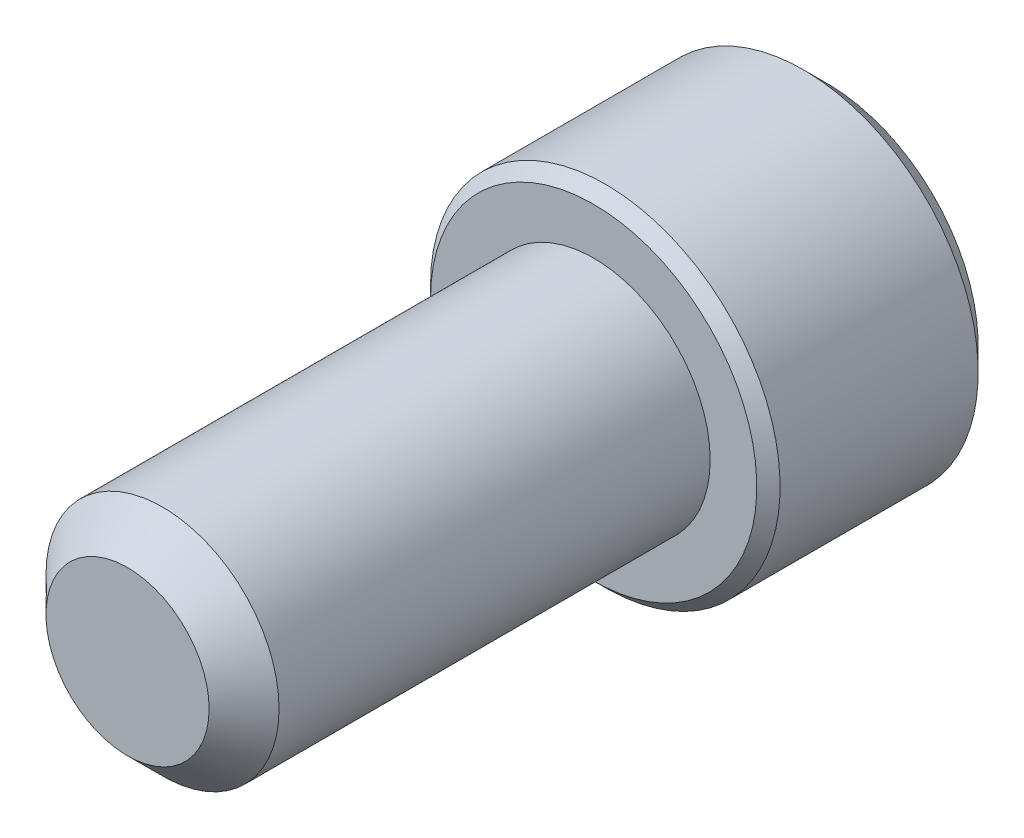
ISO-10303-21;
HEADER;
FILE_DESCRIPTION(('STEP AP214'),'2;1');
FILE_NAME('part.step','',(''),(''),'','','');
FILE_SCHEMA(('AUTOMOTIVE_DESIGN { 1 0 10303 214 1 1 1 1 }'));
ENDSEC;
DATA;
#1=APPLICATION_CONTEXT('core data for automotive mechanical design processes');
#2=APPLICATION_PROTOCOL_DEFINITION('international standard','automotive_design',2000,#1);
#3=PRODUCT_CONTEXT('',#1,'mechanical');
#4=PRODUCT('Part','Part','',(#3));
#5=PRODUCT_RELATED_PRODUCT_CATEGORY('part','',(#4));
#6=PRODUCT_DEFINITION_FORMATION('','',#4);
#7=PRODUCT_DEFINITION_CONTEXT('part definition',#1,'design');
#8=PRODUCT_DEFINITION('design','',#6,#7);
#9=PRODUCT_DEFINITION_SHAPE('','',#8);
#10=(LENGTH_UNIT() NAMED_UNIT(*) SI_UNIT(.MILLI.,.METRE.));
#11=(NAMED_UNIT(*) PLANE_ANGLE_UNIT() SI_UNIT($,.RADIAN.));
#12=(NAMED_UNIT(*) SI_UNIT($,.STERADIAN.) SOLID_ANGLE_UNIT());
#13=UNCERTAINTY_MEASURE_WITH_UNIT(LENGTH_MEASURE(1.E-05),#10,'distance_accuracy_value','');
#14=(GEOMETRIC_REPRESENTATION_CONTEXT(3) GLOBAL_UNCERTAINTY_ASSIGNED_CONTEXT((#13)) GLOBAL_UNIT_ASSIGNED_CONTEXT((#10,
#11,#12)) REPRESENTATION_CONTEXT('',''));
#15=CARTESIAN_POINT('',(0.,0.,0.));
#16=DIRECTION('',(0.,0.,1.));
#17=DIRECTION('',(1.,0.,0.));
#18=AXIS2_PLACEMENT_3D('',#15,#16,#17);
#19=CARTESIAN_POINT('',(0.,0.,-12.7));
#20=DIRECTION('',(0.,0.,1.));
#21=DIRECTION('',(1.,0.,0.));
#22=AXIS2_PLACEMENT_3D('',#19,#20,#21);
#23=CYLINDRICAL_SURFACE('',#22,3.175);
#24=CARTESIAN_POINT('',(0.,0.,-0.952500000000004));
#25=DIRECTION('',(0.,0.,1.));
#26=DIRECTION('',(1.,0.,0.));
#27=AXIS2_PLACEMENT_3D('',#24,#25,#26);
#28=CIRCLE('',#27,3.175);
#29=CARTESIAN_POINT('',(3.175,0.,-0.952500000000004));
#30=VERTEX_POINT('',#29);
#31=EDGE_CURVE('E113',#30,#30,#28,.F.);
#32=ORIENTED_EDGE('',*,*,#31,.T.);
#33=EDGE_LOOP('',(#32));
#34=FACE_BOUND('',#33,.T.);
#35=CARTESIAN_POINT('',(0.,0.,-12.7));
#36=DIRECTION('',(0.,0.,-1.));
#37=DIRECTION('',(-1.,0.,0.));
#38=AXIS2_PLACEMENT_3D('',#35,#36,#37);
#39=CIRCLE('',#38,3.175);
#40=CARTESIAN_POINT('',(-3.175,0.,-12.7));
#41=VERTEX_POINT('',#40);
#42=EDGE_CURVE('E218',#41,#41,#39,.F.);
#43=ORIENTED_EDGE('',*,*,#42,.T.);
#44=EDGE_LOOP('',(#43));
#45=FACE_BOUND('',#44,.T.);
#46=ADVANCED_FACE('F39',(#34,#45),#23,.T.);
#47=CARTESIAN_POINT('',(0.,0.,0.));
#48=DIRECTION('',(0.,0.,1.));
#49=DIRECTION('',(1.,0.,0.));
#50=AXIS2_PLACEMENT_3D('',#47,#48,#49);
#51=PLANE('',#50);
#52=CARTESIAN_POINT('',(0.,0.,0.));
#53=DIRECTION('',(0.,0.,1.));
#54=DIRECTION('',(1.,0.,0.));
#55=AXIS2_PLACEMENT_3D('',#52,#53,#54);
#56=CIRCLE('',#55,2.2225);
#57=CARTESIAN_POINT('',(2.2225,0.,0.));
#58=VERTEX_POINT('',#57);
#59=EDGE_CURVE('E217',#58,#58,#56,.T.);
#60=ORIENTED_EDGE('',*,*,#59,.T.);
#61=EDGE_LOOP('',(#60));
#62=FACE_BOUND('',#61,.T.);
#63=ADVANCED_FACE('F194',(#62),#51,.T.);
#64=CARTESIAN_POINT('',(0.,0.,0.));
#65=DIRECTION('',(0.,0.,-1.));
#66=DIRECTION('',(-1.,0.,0.));
#67=AXIS2_PLACEMENT_3D('',#64,#65,#66);
#68=CONICAL_SURFACE('',#67,2.2225,0.785398163397447);
#69=ORIENTED_EDGE('',*,*,#31,.F.);
#70=EDGE_LOOP('',(#69));
#71=FACE_BOUND('',#70,.T.);
#72=ORIENTED_EDGE('',*,*,#59,.F.);
#73=EDGE_LOOP('',(#72));
#74=FACE_BOUND('',#73,.T.);
#75=ADVANCED_FACE('F200',(#71,#74),#68,.T.);
#76=CARTESIAN_POINT('',(0.,0.,-19.05));
#77=DIRECTION('',(0.,0.,1.));
#78=DIRECTION('',(1.,0.,0.));
#79=AXIS2_PLACEMENT_3D('',#76,#77,#78);
#80=CYLINDRICAL_SURFACE('',#79,4.7625);
#81=CARTESIAN_POINT('',(0.,0.,-13.0175));
#82=DIRECTION('',(0.,0.,-1.));
#83=DIRECTION('',(-1.,0.,0.));
#84=AXIS2_PLACEMENT_3D('',#81,#82,#83);
#85=CIRCLE('',#84,4.7625);
#86=CARTESIAN_POINT('',(-4.7625,0.,-13.0175));
#87=VERTEX_POINT('',#86);
#88=EDGE_CURVE('E47',#87,#87,#85,.T.);
#89=ORIENTED_EDGE('',*,*,#88,.T.);
#90=EDGE_LOOP('',(#89));
#91=FACE_BOUND('',#90,.T.);
#92=CARTESIAN_POINT('',(0.,0.,-18.415));
#93=DIRECTION('',(0.,0.,-1.));
#94=DIRECTION('',(-1.,0.,0.));
#95=AXIS2_PLACEMENT_3D('',#92,#93,#94);
#96=CIRCLE('',#95,4.7625);
#97=CARTESIAN_POINT('',(-4.7625,0.,-18.415));
#98=VERTEX_POINT('',#97);
#99=EDGE_CURVE('E176',#98,#98,#96,.F.);
#100=ORIENTED_EDGE('',*,*,#99,.T.);
#101=EDGE_LOOP('',(#100));
#102=FACE_BOUND('',#101,.T.);
#103=ADVANCED_FACE('F181',(#91,#102),#80,.T.);
#104=CARTESIAN_POINT('',(0.,0.,-19.05));
#105=DIRECTION('',(0.,0.,-1.));
#106=DIRECTION('',(-1.,0.,0.));
#107=AXIS2_PLACEMENT_3D('',#104,#105,#106);
#108=PLANE('',#107);
#109=CARTESIAN_POINT('',(0.,0.,-19.05));
#110=DIRECTION('',(0.,0.,-1.));
#111=DIRECTION('',(-1.,0.,0.));
#112=AXIS2_PLACEMENT_3D('',#109,#110,#111);
#113=CIRCLE('',#112,4.1275);
#114=CARTESIAN_POINT('',(-4.1275,0.,-19.05));
#115=VERTEX_POINT('',#114);
#116=EDGE_CURVE('E112',#115,#115,#113,.T.);
#117=ORIENTED_EDGE('',*,*,#116,.T.);
#118=EDGE_LOOP('',(#117));
#119=FACE_BOUND('',#118,.T.);
#120=CARTESIAN_POINT('',(0.,0.,-19.05));
#121=DIRECTION('',(0.,0.,-1.));
#122=DIRECTION('',(-1.,0.,0.));
#123=AXIS2_PLACEMENT_3D('',#120,#121,#122);
#124=CIRCLE('',#123,2.74963065701559);
#125=CARTESIAN_POINT('',(-2.38125,1.3748153285078,-19.05));
#126=VERTEX_POINT('',#125);
#127=CARTESIAN_POINT('',(0.,2.74963065701559,-19.05));
#128=VERTEX_POINT('',#127);
#129=EDGE_CURVE('E93',#126,#128,#124,.T.);
#130=ORIENTED_EDGE('',*,*,#129,.F.);
#131=CARTESIAN_POINT('',(-2.38125,-1.3748153285078,-19.05));
#132=VERTEX_POINT('',#131);
#133=EDGE_CURVE('E53',#132,#126,#124,.T.);
#134=ORIENTED_EDGE('',*,*,#133,.F.);
#135=CARTESIAN_POINT('',(0.,-2.74963065701559,-19.05));
#136=VERTEX_POINT('',#135);
#137=EDGE_CURVE('E277',#136,#132,#124,.T.);
#138=ORIENTED_EDGE('',*,*,#137,.F.);
#139=CARTESIAN_POINT('',(2.38125,-1.3748153285078,-19.05));
#140=VERTEX_POINT('',#139);
#141=EDGE_CURVE('E60',#140,#136,#124,.T.);
#142=ORIENTED_EDGE('',*,*,#141,.F.);
#143=CARTESIAN_POINT('',(2.38125,1.3748153285078,-19.05));
#144=VERTEX_POINT('',#143);
#145=EDGE_CURVE('E134',#144,#140,#124,.T.);
#146=ORIENTED_EDGE('',*,*,#145,.F.);
#147=EDGE_CURVE('E102',#128,#144,#124,.T.);
#148=ORIENTED_EDGE('',*,*,#147,.F.);
#149=EDGE_LOOP('',(#130,#134,#138,#142,#146,#148));
#150=FACE_BOUND('',#149,.T.);
#151=ADVANCED_FACE('F133',(#119,#150),#108,.T.);
#152=CARTESIAN_POINT('',(0.,0.,-12.7));
#153=DIRECTION('',(0.,0.,-1.));
#154=DIRECTION('',(-1.,0.,0.));
#155=AXIS2_PLACEMENT_3D('',#152,#153,#154);
#156=PLANE('',#155);
#157=CARTESIAN_POINT('',(0.,0.,-12.7));
#158=DIRECTION('',(0.,0.,-1.));
#159=DIRECTION('',(-1.,0.,0.));
#160=AXIS2_PLACEMENT_3D('',#157,#158,#159);
#161=CIRCLE('',#160,4.44499999999999);
#162=CARTESIAN_POINT('',(-4.44499999999999,0.,-12.7));
#163=VERTEX_POINT('',#162);
#164=EDGE_CURVE('E11',#163,#163,#161,.F.);
#165=ORIENTED_EDGE('',*,*,#164,.T.);
#166=EDGE_LOOP('',(#165));
#167=FACE_BOUND('',#166,.T.);
#168=ORIENTED_EDGE('',*,*,#42,.F.);
#169=EDGE_LOOP('',(#168));
#170=FACE_BOUND('',#169,.T.);
#171=ADVANCED_FACE('F289',(#167,#170),#156,.F.);
#172=CARTESIAN_POINT('',(0.,0.,-19.05));
#173=DIRECTION('',(0.,0.,-1.));
#174=DIRECTION('',(-1.,0.,0.));
#175=AXIS2_PLACEMENT_3D('',#172,#173,#174);
#176=CONICAL_SURFACE('',#175,2.74963065701559,0.78539816339745);
#177=ORIENTED_EDGE('',*,*,#147,.T.);
#178=CARTESIAN_POINT('',(-0.000199999999999846,2.74974612706943,-19.0501154773272));
#179=CARTESIAN_POINT('',(0.0816567823790501,2.70248609172789,-19.0028948967095));
#180=CARTESIAN_POINT('',(0.16488233377176,2.65443579722785,-18.9584475752929));
#181=CARTESIAN_POINT('',(0.334588480838039,2.556455907536,-18.8770654569856));
#182=CARTESIAN_POINT('',(0.421085217353101,2.50651699342501,-18.8401759430951));
#183=CARTESIAN_POINT('',(0.59550177400904,2.40581754748857,-18.7769834131659));
#184=CARTESIAN_POINT('',(0.683377171180672,2.35508266327639,-18.7505215587295));
#185=CARTESIAN_POINT('',(0.861062594070872,2.25249593653966,-18.7097515156161));
#186=CARTESIAN_POINT('',(0.950867191185867,2.20064722822085,-18.6954128915305));
#187=CARTESIAN_POINT('',(1.10563960313034,2.11128933452158,-18.6824757847701));
#188=CARTESIAN_POINT('',(1.17040744896961,2.07389560129144,-18.6805606046532));
#189=CARTESIAN_POINT('',(1.29983727933557,1.99916925388849,-18.6837866227677));
#190=CARTESIAN_POINT('',(1.36449921879335,1.96183666573622,-18.6889302948571));
#191=CARTESIAN_POINT('',(1.49321254857739,1.88752399013711,-18.7059813108716));
#192=CARTESIAN_POINT('',(1.55726317423485,1.85054434417201,-18.7178962213493));
#193=CARTESIAN_POINT('',(1.68425683890527,1.77722451768917,-18.747835672352));
#194=CARTESIAN_POINT('',(1.74719996243582,1.74088428837517,-18.7658597445184));
#195=CARTESIAN_POINT('',(1.90842615073218,1.64780030516185,-18.8193688075524));
#196=CARTESIAN_POINT('',(2.00570949128784,1.59163374230437,-18.8588874208722));
#197=CARTESIAN_POINT('',(2.14875606262557,1.50904576583588,-18.9256003435508));
#198=CARTESIAN_POINT('',(2.19589628894396,1.4818293434813,-18.9490402091113));
#199=CARTESIAN_POINT('',(2.28930352636664,1.42790064981106,-18.9980566766595));
#200=CARTESIAN_POINT('',(2.33557105249682,1.40118808114506,-19.0236319667668));
#201=CARTESIAN_POINT('',(2.38145,1.37469985845396,-19.0501154773272));
#202=B_SPLINE_CURVE_WITH_KNOTS('',3,(#178,#179,#180,#181,#182,#183,#184,#185,#186,#187,#188,
#189,#190,#191,#192,#193,#194,#195,#196,#197,#198,#199,#200,#201),.UNSPECIFIED.,.F.,.F.,(4,2,2,
2,2,2,2,2,2,2,2,4),(0.,0.317196610611948,0.636241461041215,0.950218950629218,1.26340583824125,
1.48752413747843,1.71172100167746,1.93616888974081,2.16059957440835,2.51709639744762,
2.69486147369099,2.87251813383154),.UNSPECIFIED.);
#203=EDGE_CURVE('E107',#128,#144,#202,.T.);
#204=ORIENTED_EDGE('',*,*,#203,.F.);
#205=EDGE_LOOP('',(#177,#204));
#206=FACE_BOUND('',#205,.T.);
#207=ADVANCED_FACE('F108',(#206),#176,.F.);
#208=ORIENTED_EDGE('',*,*,#145,.T.);
#209=CARTESIAN_POINT('',(2.38125,-2.76261914417824,-19.9476170859106));
#210=CARTESIAN_POINT('',(2.38125,-2.69544479514943,-19.8967472144995));
#211=CARTESIAN_POINT('',(2.38125,-2.62789666136504,-19.846362945401));
#212=CARTESIAN_POINT('',(2.38125,-2.49190448957586,-19.7467837706916));
#213=CARTESIAN_POINT('',(2.38125,-2.42346023302515,-19.6975891638687));
#214=CARTESIAN_POINT('',(2.38125,-2.28502676055597,-19.6002575506406));
#215=CARTESIAN_POINT('',(2.38125,-2.21502968474886,-19.5521316855727));
#216=CARTESIAN_POINT('',(2.38125,-2.07385103533268,-19.4576556100283));
#217=CARTESIAN_POINT('',(2.38125,-2.00266954553302,-19.411305274675));
#218=CARTESIAN_POINT('',(2.38125,-1.85474026830089,-19.3181368560841));
#219=CARTESIAN_POINT('',(2.38125,-1.7779099562422,-19.2714491375715));
#220=CARTESIAN_POINT('',(2.38125,-1.62247617005921,-19.1811296057942));
#221=CARTESIAN_POINT('',(2.38125,-1.5438729311814,-19.1374973902174));
#222=CARTESIAN_POINT('',(2.38125,-1.38486272128664,-19.0542071099829));
#223=CARTESIAN_POINT('',(2.38125,-1.30446163385103,-19.0145379008969));
#224=CARTESIAN_POINT('',(2.38125,-1.14145314541121,-18.9400690458985));
#225=CARTESIAN_POINT('',(2.38125,-1.05884677103565,-18.9052671795911));
#226=CARTESIAN_POINT('',(2.38125,-0.89829608328261,-18.8444298132105));
#227=CARTESIAN_POINT('',(2.38125,-0.820539229676336,-18.8179047139138));
#228=CARTESIAN_POINT('',(2.38125,-0.663135380788207,-18.77108983919));
#229=CARTESIAN_POINT('',(2.38125,-0.583488257424663,-18.7508004875941));
#230=CARTESIAN_POINT('',(2.38125,-0.424114177011517,-18.7178604073761));
#231=CARTESIAN_POINT('',(2.38125,-0.344414987413467,-18.7050775336893));
#232=CARTESIAN_POINT('',(2.38125,-0.184141832260061,-18.6874018129175));
#233=CARTESIAN_POINT('',(2.38125,-0.103568024425043,-18.6825075663093));
#234=CARTESIAN_POINT('',(2.38125,0.0546452705616252,-18.6809814589787));
#235=CARTESIAN_POINT('',(2.38125,0.132281935936974,-18.6840477838015));
#236=CARTESIAN_POINT('',(2.38125,0.286899761946942,-18.6976029014762));
#237=CARTESIAN_POINT('',(2.38125,0.363880858805097,-18.7080924083237));
#238=CARTESIAN_POINT('',(2.38125,0.517934845692862,-18.7360957917082));
#239=CARTESIAN_POINT('',(2.38125,0.594985552658727,-18.7537299282713));
#240=CARTESIAN_POINT('',(2.38125,0.747397785123021,-18.7950790150478));
#241=CARTESIAN_POINT('',(2.38125,0.822759444233749,-18.8187934824167));
#242=CARTESIAN_POINT('',(2.38125,1.05910849758949,-18.9021079749778));
#243=CARTESIAN_POINT('',(2.38125,1.21677702119331,-18.9711581303657));
#244=CARTESIAN_POINT('',(2.38125,1.44750538939388,-19.0862600463764));
#245=CARTESIAN_POINT('',(2.38125,1.52359597421917,-19.1266390557991));
#246=CARTESIAN_POINT('',(2.38125,1.67404919609776,-19.2105045048813));
#247=CARTESIAN_POINT('',(2.38125,1.74841214000066,-19.2539903870446));
#248=CARTESIAN_POINT('',(2.38125,1.89195740338858,-19.3412197494794));
#249=CARTESIAN_POINT('',(2.38125,1.96121356031989,-19.3848431033927));
#250=CARTESIAN_POINT('',(2.38125,2.09853826202223,-19.4739297074865));
#251=CARTESIAN_POINT('',(2.38125,2.1666067164336,-19.5193930967897));
#252=CARTESIAN_POINT('',(2.38125,2.30115854952533,-19.6114552847002));
#253=CARTESIAN_POINT('',(2.38125,2.36765030430946,-19.6580418921343));
#254=CARTESIAN_POINT('',(2.38125,2.4997244423484,-19.7524503252218));
#255=CARTESIAN_POINT('',(2.38125,2.56530707078418,-19.8002718074761));
#256=CARTESIAN_POINT('',(2.38125,2.63050907003795,-19.8485984125418));
#257=B_SPLINE_CURVE_WITH_KNOTS('',3,(#209,#210,#211,#212,#213,#214,#215,#216,#217,#218,#219,
#220,#221,#222,#223,#224,#225,#226,#227,#228,#229,#230,#231,#232,#233,#234,#235,#236,#237,#238,
#239,#240,#241,#242,#243,#244,#245,#246,#247,#248,#249,#250,#251,#252,#253,#254,#255,#256),
.UNSPECIFIED.,.F.,.F.,(4,2,2,2,2,2,2,2,2,2,2,2,2,2,2,2,2,2,2,2,2,2,2,4),(0.,0.252791871571638,
0.505646586835588,0.760459562131612,1.01525458283614,1.28490904188232,1.55452792903166,
1.82336591130764,2.09208085165785,2.33833488206072,2.58460564615637,2.82639989360531,
3.06815123955512,3.30087188920716,3.53361492603847,3.7704500560164,4.00726638452657,
4.52203846870487,4.78044014413054,5.03879556793988,5.28431582240014,5.52985467514945,
5.77340315432297,6.01688462076591),.UNSPECIFIED.);
#258=EDGE_CURVE('E101',#144,#140,#257,.F.);
#259=ORIENTED_EDGE('',*,*,#258,.F.);
#260=EDGE_LOOP('',(#208,#259));
#261=FACE_BOUND('',#260,.T.);
#262=ADVANCED_FACE('F283',(#261),#176,.F.);
#263=ORIENTED_EDGE('',*,*,#141,.T.);
#264=CARTESIAN_POINT('',(2.38145,-1.37469985845396,-19.0501154773272));
#265=CARTESIAN_POINT('',(2.29959321762095,-1.4219598937955,-19.0028948967095));
#266=CARTESIAN_POINT('',(2.21636766622824,-1.47001018829554,-18.9584475752929));
#267=CARTESIAN_POINT('',(2.04666151916196,-1.56799007798739,-18.8770654569856));
#268=CARTESIAN_POINT('',(1.9601647826469,-1.61792899209838,-18.8401759430951));
#269=CARTESIAN_POINT('',(1.78574822599096,-1.71862843803482,-18.7769834131659));
#270=CARTESIAN_POINT('',(1.69787282881933,-1.769363322247,-18.7505215587295));
#271=CARTESIAN_POINT('',(1.52018740592913,-1.87195004898373,-18.7097515156161));
#272=CARTESIAN_POINT('',(1.43038280881413,-1.92379875730254,-18.6954128915305));
#273=CARTESIAN_POINT('',(1.27561039686966,-2.01315665100181,-18.6824757847701));
#274=CARTESIAN_POINT('',(1.21084255103038,-2.05055038423195,-18.6805606046532));
#275=CARTESIAN_POINT('',(1.08141272066443,-2.1252767316349,-18.6837866227677));
#276=CARTESIAN_POINT('',(1.01675078120665,-2.16260931978717,-18.6889302948571));
#277=CARTESIAN_POINT('',(0.888037451422605,-2.23692199538628,-18.7059813108716));
#278=CARTESIAN_POINT('',(0.823986825765147,-2.27390164135138,-18.7178962213493));
#279=CARTESIAN_POINT('',(0.696993161094728,-2.34722146783422,-18.747835672352));
#280=CARTESIAN_POINT('',(0.634050037564177,-2.38356169714822,-18.7658597445185));
#281=CARTESIAN_POINT('',(0.472823849267819,-2.47664568036154,-18.8193688075524));
#282=CARTESIAN_POINT('',(0.375540508712161,-2.53281224321902,-18.8588874208722));
#283=CARTESIAN_POINT('',(0.23249393737443,-2.61540021968751,-18.9256003435508));
#284=CARTESIAN_POINT('',(0.185353711056036,-2.6426166420421,-18.9490402091113));
#285=CARTESIAN_POINT('',(0.0919464736333621,-2.69654533571233,-18.9980566766595));
#286=CARTESIAN_POINT('',(0.0456789475031785,-2.72325790437833,-19.0236319667669));
#287=CARTESIAN_POINT('',(-0.000200000000000443,-2.74974612706943,-19.0501154773272));
#288=B_SPLINE_CURVE_WITH_KNOTS('',3,(#264,#265,#266,#267,#268,#269,#270,#271,#272,#273,#274,
#275,#276,#277,#278,#279,#280,#281,#282,#283,#284,#285,#286,#287),.UNSPECIFIED.,.F.,.F.,(4,2,2,
2,2,2,2,2,2,2,2,4),(0.,0.31719661061195,0.636241461041218,0.950218950629222,1.26340583824126,
1.48752413747844,1.71172100167747,1.93616888974082,2.16059957440836,2.51709639744763,
2.69486147369099,2.87251813383154),.UNSPECIFIED.);
#289=EDGE_CURVE('E144',#140,#136,#288,.T.);
#290=ORIENTED_EDGE('',*,*,#289,.F.);
#291=EDGE_LOOP('',(#263,#290));
#292=FACE_BOUND('',#291,.T.);
#293=ADVANCED_FACE('F280',(#292),#176,.F.);
#294=ORIENTED_EDGE('',*,*,#137,.T.);
#295=CARTESIAN_POINT('',(0.000200000000000387,-2.74974612706943,-19.0501154773272));
#296=CARTESIAN_POINT('',(-0.0816567823790491,-2.70248609172789,-19.0028948967095));
#297=CARTESIAN_POINT('',(-0.164882333771759,-2.65443579722785,-18.9584475752929));
#298=CARTESIAN_POINT('',(-0.334588480838039,-2.556455907536,-18.8770654569856));
#299=CARTESIAN_POINT('',(-0.421085217353102,-2.50651699342501,-18.8401759430951));
#300=CARTESIAN_POINT('',(-0.595501774009042,-2.40581754748857,-18.7769834131659));
#301=CARTESIAN_POINT('',(-0.683377171180674,-2.35508266327639,-18.7505215587295));
#302=CARTESIAN_POINT('',(-0.861062594070875,-2.25249593653966,-18.7097515156161));
#303=CARTESIAN_POINT('',(-0.950867191185871,-2.20064722822085,-18.6954128915305));
#304=CARTESIAN_POINT('',(-1.10563960313034,-2.11128933452158,-18.6824757847701));
#305=CARTESIAN_POINT('',(-1.17040744896962,-2.07389560129144,-18.6805606046532));
#306=CARTESIAN_POINT('',(-1.29983727933557,-1.99916925388849,-18.6837866227677));
#307=CARTESIAN_POINT('',(-1.36449921879336,-1.96183666573622,-18.6889302948571));
#308=CARTESIAN_POINT('',(-1.4932125485774,-1.88752399013711,-18.7059813108716));
#309=CARTESIAN_POINT('',(-1.55726317423485,-1.85054434417201,-18.7178962213493));
#310=CARTESIAN_POINT('',(-1.68425683890527,-1.77722451768917,-18.747835672352));
#311=CARTESIAN_POINT('',(-1.74719996243582,-1.74088428837517,-18.7658597445185));
#312=CARTESIAN_POINT('',(-1.90842615073218,-1.64780030516185,-18.8193688075524));
#313=CARTESIAN_POINT('',(-2.00570949128784,-1.59163374230437,-18.8588874208722));
#314=CARTESIAN_POINT('',(-2.14875606262557,-1.50904576583588,-18.9256003435508));
#315=CARTESIAN_POINT('',(-2.19589628894397,-1.48182934348129,-18.9490402091113));
#316=CARTESIAN_POINT('',(-2.28930352636664,-1.42790064981105,-18.9980566766595));
#317=CARTESIAN_POINT('',(-2.33557105249682,-1.40118808114506,-19.0236319667669));
#318=CARTESIAN_POINT('',(-2.38145,-1.37469985845396,-19.0501154773272));
#319=B_SPLINE_CURVE_WITH_KNOTS('',3,(#295,#296,#297,#298,#299,#300,#301,#302,#303,#304,#305,
#306,#307,#308,#309,#310,#311,#312,#313,#314,#315,#316,#317,#318),.UNSPECIFIED.,.F.,.F.,(4,2,2,
2,2,2,2,2,2,2,2,4),(0.,0.31719661061195,0.636241461041219,0.950218950629222,1.26340583824126,
1.48752413747844,1.71172100167747,1.93616888974082,2.16059957440836,2.51709639744763,
2.69486147369099,2.87251813383154),.UNSPECIFIED.);
#320=EDGE_CURVE('E254',#136,#132,#319,.T.);
#321=ORIENTED_EDGE('',*,*,#320,.F.);
#322=EDGE_LOOP('',(#294,#321));
#323=FACE_BOUND('',#322,.T.);
#324=ADVANCED_FACE('F279',(#323),#176,.F.);
#325=ORIENTED_EDGE('',*,*,#133,.T.);
#326=CARTESIAN_POINT('',(-2.38125,-2.76261914440418,-19.9476170860817));
#327=CARTESIAN_POINT('',(-2.38125,-2.69544479536901,-19.8967472146641));
#328=CARTESIAN_POINT('',(-2.38125,-2.62789666157823,-19.8463629455589));
#329=CARTESIAN_POINT('',(-2.38125,-2.4919044897762,-19.7467837708364));
#330=CARTESIAN_POINT('',(-2.38125,-2.42346023321903,-19.6975891640069));
#331=CARTESIAN_POINT('',(-2.38125,-2.28502676073673,-19.6002575507657));
#332=CARTESIAN_POINT('',(-2.38125,-2.21502968492295,-19.5521316856912));
#333=CARTESIAN_POINT('',(-2.38125,-2.0738510354933,-19.4576556101338));
#334=CARTESIAN_POINT('',(-2.38125,-2.00266954568685,-19.4113052747739));
#335=CARTESIAN_POINT('',(-2.38125,-1.85474026844006,-19.3181368561695));
#336=CARTESIAN_POINT('',(-2.38125,-1.77790995637349,-19.2714491376499));
#337=CARTESIAN_POINT('',(-2.38125,-1.62247617017446,-19.181129605859));
#338=CARTESIAN_POINT('',(-2.38125,-1.54387293128849,-19.1374973902755));
#339=CARTESIAN_POINT('',(-2.38125,-1.38486272137712,-19.0542071100282));
#340=CARTESIAN_POINT('',(-2.38125,-1.30446163393305,-19.0145379009361));
#341=CARTESIAN_POINT('',(-2.38125,-1.14145314547588,-18.9400690459263));
#342=CARTESIAN_POINT('',(-2.38125,-1.05884677109141,-18.9052671796135));
#343=CARTESIAN_POINT('',(-2.38125,-0.898296083334547,-18.844429813229));
#344=CARTESIAN_POINT('',(-2.38125,-0.820539229733746,-18.8179047139327));
#345=CARTESIAN_POINT('',(-2.38125,-0.663135380856745,-18.7710898392085));
#346=CARTESIAN_POINT('',(-2.38125,-0.583488257498855,-18.7508004876119));
#347=CARTESIAN_POINT('',(-2.38125,-0.424114177096837,-18.7178604073913));
#348=CARTESIAN_POINT('',(-2.38125,-0.344414987504256,-18.7050775337025));
#349=CARTESIAN_POINT('',(-2.38125,-0.184141832361611,-18.6874018129255));
#350=CARTESIAN_POINT('',(-2.38125,-0.103568024531885,-18.6825075663141));
#351=CARTESIAN_POINT('',(-2.38125,0.0546452704451481,-18.6809814589761));
#352=CARTESIAN_POINT('',(-2.38125,0.132281935816141,-18.6840477837949));
#353=CARTESIAN_POINT('',(-2.38125,0.286899761817839,-18.6976029014608));
#354=CARTESIAN_POINT('',(-2.38125,0.363880858672082,-18.7080924083037));
#355=CARTESIAN_POINT('',(-2.38125,0.517934845552124,-18.7360957916784));
#356=CARTESIAN_POINT('',(-2.38125,0.594985552514191,-18.7537299282363));
#357=CARTESIAN_POINT('',(-2.38125,0.747397784971259,-18.7950790150024));
#358=CARTESIAN_POINT('',(-2.38125,0.82275944407856,-18.8187934823661));
#359=CARTESIAN_POINT('',(-2.38125,1.05910849740065,-18.9021079749025));
#360=CARTESIAN_POINT('',(-2.38125,1.21677702097592,-18.9711581302676));
#361=CARTESIAN_POINT('',(-2.38125,1.44750538913539,-19.0862600462423));
#362=CARTESIAN_POINT('',(-2.38125,1.52359597394723,-19.1266390556526));
#363=CARTESIAN_POINT('',(-2.38125,1.67404919579933,-19.2105045047098));
#364=CARTESIAN_POINT('',(-2.38125,1.7484121396892,-19.2539903868603));
#365=CARTESIAN_POINT('',(-2.38125,1.89195740305345,-19.341219749271));
#366=CARTESIAN_POINT('',(-2.38125,1.96121355997407,-19.3848431031729));
#367=CARTESIAN_POINT('',(-2.38125,2.09853826165519,-19.4739297072439));
#368=CARTESIAN_POINT('',(-2.38125,2.16660671605602,-19.5193930965356));
#369=CARTESIAN_POINT('',(-2.38125,2.30115854912695,-19.6114552844234));
#370=CARTESIAN_POINT('',(-2.38125,2.36765030390079,-19.6580418918462));
#371=CARTESIAN_POINT('',(-2.38125,2.49972444191924,-19.7524503249111));
#372=CARTESIAN_POINT('',(-2.38125,2.5653070703448,-19.8002718071541));
#373=CARTESIAN_POINT('',(-2.38125,2.63050906958837,-19.8485984122085));
#374=B_SPLINE_CURVE_WITH_KNOTS('',3,(#326,#327,#328,#329,#330,#331,#332,#333,#334,#335,#336,
#337,#338,#339,#340,#341,#342,#343,#344,#345,#346,#347,#348,#349,#350,#351,#352,#353,#354,#355,
#356,#357,#358,#359,#360,#361,#362,#363,#364,#365,#366,#367,#368,#369,#370,#371,#372,#373),
.UNSPECIFIED.,.F.,.F.,(4,2,2,2,2,2,2,2,2,2,2,2,2,2,2,2,2,2,2,2,2,2,2,4),(0.,0.252791871598823,
0.505646586889968,0.760459562213691,1.01525458294592,1.2849090420232,1.55452792920363,
1.82336591151044,2.09208085189145,2.33833488227845,2.58460564635828,2.82639989379204,
3.06815123972667,3.30087188936524,3.53361492618304,3.77045005614642,4.00726638464204,
4.52203846871502,4.78044014408766,5.03879556784399,5.28431582225891,5.52985467496288,
5.77340315409167,6.01688462048989),.UNSPECIFIED.);
#375=EDGE_CURVE('E123',#132,#126,#374,.T.);
#376=ORIENTED_EDGE('',*,*,#375,.F.);
#377=EDGE_LOOP('',(#325,#376));
#378=FACE_BOUND('',#377,.T.);
#379=ADVANCED_FACE('F295',(#378),#176,.F.);
#380=ORIENTED_EDGE('',*,*,#129,.T.);
#381=CARTESIAN_POINT('',(-2.38145,1.37469985845396,-19.0501154773272));
#382=CARTESIAN_POINT('',(-2.29959321762095,1.4219598937955,-19.0028948967095));
#383=CARTESIAN_POINT('',(-2.21636766622824,1.47001018829554,-18.9584475752929));
#384=CARTESIAN_POINT('',(-2.04666151916196,1.56799007798739,-18.8770654569856));
#385=CARTESIAN_POINT('',(-1.9601647826469,1.61792899209838,-18.8401759430951));
#386=CARTESIAN_POINT('',(-1.78574822599096,1.71862843803482,-18.7769834131659));
#387=CARTESIAN_POINT('',(-1.69787282881933,1.769363322247,-18.7505215587295));
#388=CARTESIAN_POINT('',(-1.52018740592913,1.87195004898373,-18.7097515156161));
#389=CARTESIAN_POINT('',(-1.43038280881413,1.92379875730254,-18.6954128915305));
#390=CARTESIAN_POINT('',(-1.27561039686966,2.01315665100181,-18.6824757847701));
#391=CARTESIAN_POINT('',(-1.21084255103038,2.05055038423195,-18.6805606046532));
#392=CARTESIAN_POINT('',(-1.08141272066443,2.1252767316349,-18.6837866227677));
#393=CARTESIAN_POINT('',(-1.01675078120665,2.16260931978717,-18.6889302948571));
#394=CARTESIAN_POINT('',(-0.888037451422604,2.23692199538628,-18.7059813108716));
#395=CARTESIAN_POINT('',(-0.823986825765147,2.27390164135138,-18.7178962213493));
#396=CARTESIAN_POINT('',(-0.696993161094727,2.34722146783422,-18.747835672352));
#397=CARTESIAN_POINT('',(-0.634050037564176,2.38356169714822,-18.7658597445185));
#398=CARTESIAN_POINT('',(-0.472823849267819,2.47664568036154,-18.8193688075524));
#399=CARTESIAN_POINT('',(-0.375540508712162,2.53281224321902,-18.8588874208722));
#400=CARTESIAN_POINT('',(-0.232493937374431,2.61540021968751,-18.9256003435508));
#401=CARTESIAN_POINT('',(-0.185353711056037,2.64261664204209,-18.9490402091113));
#402=CARTESIAN_POINT('',(-0.0919464736333625,2.69654533571233,-18.9980566766595));
#403=CARTESIAN_POINT('',(-0.0456789475031788,2.72325790437833,-19.0236319667668));
#404=CARTESIAN_POINT('',(0.000199999999999511,2.74974612706943,-19.0501154773272));
#405=B_SPLINE_CURVE_WITH_KNOTS('',3,(#381,#382,#383,#384,#385,#386,#387,#388,#389,#390,#391,
#392,#393,#394,#395,#396,#397,#398,#399,#400,#401,#402,#403,#404),.UNSPECIFIED.,.F.,.F.,(4,2,2,
2,2,2,2,2,2,2,2,4),(0.,0.317196610611949,0.636241461041219,0.950218950629222,1.26340583824126,
1.48752413747844,1.71172100167747,1.93616888974082,2.16059957440836,2.51709639744763,
2.69486147369099,2.87251813383154),.UNSPECIFIED.);
#406=EDGE_CURVE('E97',#126,#128,#405,.T.);
#407=ORIENTED_EDGE('',*,*,#406,.F.);
#408=EDGE_LOOP('',(#380,#407));
#409=FACE_BOUND('',#408,.T.);
#410=ADVANCED_FACE('F95',(#409),#176,.F.);
#411=CARTESIAN_POINT('',(2.38125,4.12444598552339,-15.478125));
#412=DIRECTION('',(0.,0.,-1.));
#413=DIRECTION('',(-1.,0.,0.));
#414=AXIS2_PLACEMENT_3D('',#411,#412,#413);
#415=PLANE('',#414);
#416=DIRECTION('',(0.866025403784439,0.5,0.));
#417=VECTOR('',#416,1.);
#418=CARTESIAN_POINT('',(-2.38125,1.3748153285078,-15.478125));
#419=LINE('',#418,#417);
#420=CARTESIAN_POINT('',(-2.38125,1.3748153285078,-15.478125));
#421=VERTEX_POINT('',#420);
#422=CARTESIAN_POINT('',(0.,2.74963065701559,-15.478125));
#423=VERTEX_POINT('',#422);
#424=EDGE_CURVE('E122',#421,#423,#419,.T.);
#425=ORIENTED_EDGE('',*,*,#424,.T.);
#426=DIRECTION('',(0.866025403784439,-0.5,0.));
#427=VECTOR('',#426,1.);
#428=CARTESIAN_POINT('',(0.,2.74963065701559,-15.478125));
#429=LINE('',#428,#427);
#430=CARTESIAN_POINT('',(2.38125,1.3748153285078,-15.478125));
#431=VERTEX_POINT('',#430);
#432=EDGE_CURVE('E127',#423,#431,#429,.T.);
#433=ORIENTED_EDGE('',*,*,#432,.T.);
#434=DIRECTION('',(0.,-1.,0.));
#435=VECTOR('',#434,1.);
#436=CARTESIAN_POINT('',(2.38125,1.3748153285078,-15.478125));
#437=LINE('',#436,#435);
#438=CARTESIAN_POINT('',(2.38125,-1.3748153285078,-15.478125));
#439=VERTEX_POINT('',#438);
#440=EDGE_CURVE('E240',#431,#439,#437,.T.);
#441=ORIENTED_EDGE('',*,*,#440,.T.);
#442=DIRECTION('',(-0.866025403784439,-0.5,0.));
#443=VECTOR('',#442,1.);
#444=CARTESIAN_POINT('',(2.38125,-1.3748153285078,-15.478125));
#445=LINE('',#444,#443);
#446=CARTESIAN_POINT('',(0.,-2.74963065701559,-15.478125));
#447=VERTEX_POINT('',#446);
#448=EDGE_CURVE('E237',#439,#447,#445,.T.);
#449=ORIENTED_EDGE('',*,*,#448,.T.);
#450=DIRECTION('',(-0.866025403784439,0.5,0.));
#451=VECTOR('',#450,1.);
#452=CARTESIAN_POINT('',(0.,-2.74963065701559,-15.478125));
#453=LINE('',#452,#451);
#454=CARTESIAN_POINT('',(-2.38125,-1.3748153285078,-15.478125));
#455=VERTEX_POINT('',#454);
#456=EDGE_CURVE('E234',#447,#455,#453,.T.);
#457=ORIENTED_EDGE('',*,*,#456,.T.);
#458=DIRECTION('',(0.,1.,0.));
#459=VECTOR('',#458,1.);
#460=CARTESIAN_POINT('',(-2.38125,-1.3748153285078,-15.478125));
#461=LINE('',#460,#459);
#462=EDGE_CURVE('E130',#455,#421,#461,.T.);
#463=ORIENTED_EDGE('',*,*,#462,.T.);
#464=EDGE_LOOP('',(#425,#433,#441,#449,#457,#463));
#465=FACE_BOUND('',#464,.T.);
#466=ADVANCED_FACE('F164',(#465),#415,.T.);
#467=CARTESIAN_POINT('',(0.,2.74963065701559,-15.478125));
#468=DIRECTION('',(0.5,0.866025403784439,0.));
#469=DIRECTION('',(-0.866025403784439,0.5,0.));
#470=AXIS2_PLACEMENT_3D('',#467,#468,#469);
#471=PLANE('',#470);
#472=DIRECTION('',(0.,0.,-1.));
#473=VECTOR('',#472,1.);
#474=CARTESIAN_POINT('',(0.,2.74963065701559,-15.478125));
#475=LINE('',#474,#473);
#476=EDGE_CURVE('E119',#423,#128,#475,.T.);
#477=ORIENTED_EDGE('',*,*,#476,.T.);
#478=ORIENTED_EDGE('',*,*,#203,.T.);
#479=DIRECTION('',(0.,0.,-1.));
#480=VECTOR('',#479,1.);
#481=CARTESIAN_POINT('',(2.38125,1.3748153285078,-15.478125));
#482=LINE('',#481,#480);
#483=EDGE_CURVE('E129',#431,#144,#482,.T.);
#484=ORIENTED_EDGE('',*,*,#483,.F.);
#485=ORIENTED_EDGE('',*,*,#432,.F.);
#486=EDGE_LOOP('',(#477,#478,#484,#485));
#487=FACE_BOUND('',#486,.T.);
#488=ADVANCED_FACE('F125',(#487),#471,.F.);
#489=CARTESIAN_POINT('',(2.38125,1.3748153285078,-15.478125));
#490=DIRECTION('',(1.,0.,0.));
#491=DIRECTION('',(0.,0.,-1.));
#492=AXIS2_PLACEMENT_3D('',#489,#490,#491);
#493=PLANE('',#492);
#494=ORIENTED_EDGE('',*,*,#483,.T.);
#495=ORIENTED_EDGE('',*,*,#258,.T.);
#496=DIRECTION('',(0.,0.,-1.));
#497=VECTOR('',#496,1.);
#498=CARTESIAN_POINT('',(2.38125,-1.3748153285078,-15.478125));
#499=LINE('',#498,#497);
#500=EDGE_CURVE('E223',#439,#140,#499,.T.);
#501=ORIENTED_EDGE('',*,*,#500,.F.);
#502=ORIENTED_EDGE('',*,*,#440,.F.);
#503=EDGE_LOOP('',(#494,#495,#501,#502));
#504=FACE_BOUND('',#503,.T.);
#505=ADVANCED_FACE('F153',(#504),#493,.F.);
#506=CARTESIAN_POINT('',(2.38125,-1.3748153285078,-15.478125));
#507=DIRECTION('',(0.5,-0.866025403784438,0.));
#508=DIRECTION('',(0.866025403784439,0.5,0.));
#509=AXIS2_PLACEMENT_3D('',#506,#507,#508);
#510=PLANE('',#509);
#511=ORIENTED_EDGE('',*,*,#500,.T.);
#512=ORIENTED_EDGE('',*,*,#289,.T.);
#513=DIRECTION('',(0.,0.,-1.));
#514=VECTOR('',#513,1.);
#515=CARTESIAN_POINT('',(0.,-2.74963065701559,-15.478125));
#516=LINE('',#515,#514);
#517=EDGE_CURVE('E226',#447,#136,#516,.T.);
#518=ORIENTED_EDGE('',*,*,#517,.F.);
#519=ORIENTED_EDGE('',*,*,#448,.F.);
#520=EDGE_LOOP('',(#511,#512,#518,#519));
#521=FACE_BOUND('',#520,.T.);
#522=ADVANCED_FACE('F157',(#521),#510,.F.);
#523=CARTESIAN_POINT('',(0.,-2.74963065701559,-15.478125));
#524=DIRECTION('',(-0.5,-0.866025403784439,0.));
#525=DIRECTION('',(0.866025403784439,-0.5,0.));
#526=AXIS2_PLACEMENT_3D('',#523,#524,#525);
#527=PLANE('',#526);
#528=ORIENTED_EDGE('',*,*,#517,.T.);
#529=ORIENTED_EDGE('',*,*,#320,.T.);
#530=DIRECTION('',(0.,0.,-1.));
#531=VECTOR('',#530,1.);
#532=CARTESIAN_POINT('',(-2.38125,-1.3748153285078,-15.478125));
#533=LINE('',#532,#531);
#534=EDGE_CURVE('E229',#455,#132,#533,.T.);
#535=ORIENTED_EDGE('',*,*,#534,.F.);
#536=ORIENTED_EDGE('',*,*,#456,.F.);
#537=EDGE_LOOP('',(#528,#529,#535,#536));
#538=FACE_BOUND('',#537,.T.);
#539=ADVANCED_FACE('F262',(#538),#527,.F.);
#540=CARTESIAN_POINT('',(-2.38125,-1.3748153285078,-15.478125));
#541=DIRECTION('',(-1.,0.,0.));
#542=DIRECTION('',(0.,-1.,0.));
#543=AXIS2_PLACEMENT_3D('',#540,#541,#542);
#544=PLANE('',#543);
#545=ORIENTED_EDGE('',*,*,#534,.T.);
#546=ORIENTED_EDGE('',*,*,#375,.T.);
#547=DIRECTION('',(0.,0.,-1.));
#548=VECTOR('',#547,1.);
#549=CARTESIAN_POINT('',(-2.38125,1.3748153285078,-15.478125));
#550=LINE('',#549,#548);
#551=EDGE_CURVE('E121',#421,#126,#550,.T.);
#552=ORIENTED_EDGE('',*,*,#551,.F.);
#553=ORIENTED_EDGE('',*,*,#462,.F.);
#554=EDGE_LOOP('',(#545,#546,#552,#553));
#555=FACE_BOUND('',#554,.T.);
#556=ADVANCED_FACE('F259',(#555),#544,.F.);
#557=CARTESIAN_POINT('',(-2.38125,1.3748153285078,-15.478125));
#558=DIRECTION('',(-0.5,0.866025403784439,0.));
#559=DIRECTION('',(-0.866025403784439,-0.5,0.));
#560=AXIS2_PLACEMENT_3D('',#557,#558,#559);
#561=PLANE('',#560);
#562=ORIENTED_EDGE('',*,*,#551,.T.);
#563=ORIENTED_EDGE('',*,*,#406,.T.);
#564=ORIENTED_EDGE('',*,*,#476,.F.);
#565=ORIENTED_EDGE('',*,*,#424,.F.);
#566=EDGE_LOOP('',(#562,#563,#564,#565));
#567=FACE_BOUND('',#566,.T.);
#568=ADVANCED_FACE('F117',(#567),#561,.F.);
#569=CARTESIAN_POINT('',(0.,0.,-19.05));
#570=DIRECTION('',(0.,0.,1.));
#571=DIRECTION('',(1.,0.,0.));
#572=AXIS2_PLACEMENT_3D('',#569,#570,#571);
#573=CONICAL_SURFACE('',#572,4.1275,0.785398163397446);
#574=ORIENTED_EDGE('',*,*,#99,.F.);
#575=EDGE_LOOP('',(#574));
#576=FACE_BOUND('',#575,.T.);
#577=ORIENTED_EDGE('',*,*,#116,.F.);
#578=EDGE_LOOP('',(#577));
#579=FACE_BOUND('',#578,.T.);
#580=ADVANCED_FACE('F185',(#576,#579),#573,.T.);
#581=CARTESIAN_POINT('',(0.,0.,-13.0175));
#582=DIRECTION('',(0.,0.,-1.));
#583=DIRECTION('',(-1.,0.,0.));
#584=AXIS2_PLACEMENT_3D('',#581,#582,#583);
#585=CONICAL_SURFACE('',#584,4.7625,0.785398163397458);
#586=ORIENTED_EDGE('',*,*,#164,.F.);
#587=EDGE_LOOP('',(#586));
#588=FACE_BOUND('',#587,.T.);
#589=ORIENTED_EDGE('',*,*,#88,.F.);
#590=EDGE_LOOP('',(#589));
#591=FACE_BOUND('',#590,.T.);
#592=ADVANCED_FACE('F41',(#588,#591),#585,.T.);
#593=CLOSED_SHELL('',(#46,#63,#75,#103,#151,#171,#207,#262,#293,#324,#379,#410,#466,#488,#505,
#522,#539,#556,#568,#580,#592));
#594=MANIFOLD_SOLID_BREP('B2',#593);
#595=ADVANCED_BREP_SHAPE_REPRESENTATION('',(#18,#594),#14);
#596=SHAPE_DEFINITION_REPRESENTATION(#9,#595);
ENDSEC;
END-ISO-10303-21;
